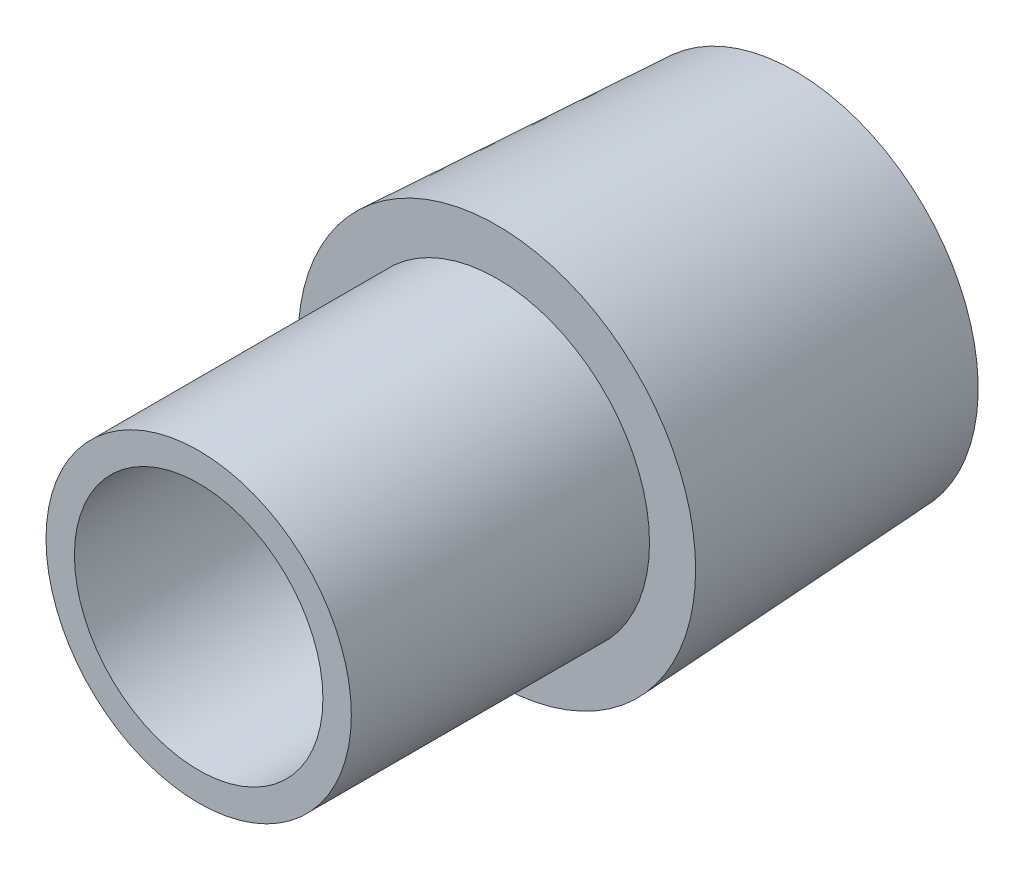
ISO-10303-21;
HEADER;
FILE_DESCRIPTION(('STEP AP214'),'2;1');
FILE_NAME('part.step','',(''),(''),'','','');
FILE_SCHEMA(('AUTOMOTIVE_DESIGN { 1 0 10303 214 1 1 1 1 }'));
ENDSEC;
DATA;
#1=APPLICATION_CONTEXT('core data for automotive mechanical design processes');
#2=APPLICATION_PROTOCOL_DEFINITION('international standard','automotive_design',2000,#1);
#3=PRODUCT_CONTEXT('',#1,'mechanical');
#4=PRODUCT('Part','Part','',(#3));
#5=PRODUCT_RELATED_PRODUCT_CATEGORY('part','',(#4));
#6=PRODUCT_DEFINITION_FORMATION('','',#4);
#7=PRODUCT_DEFINITION_CONTEXT('part definition',#1,'design');
#8=PRODUCT_DEFINITION('design','',#6,#7);
#9=PRODUCT_DEFINITION_SHAPE('','',#8);
#10=(LENGTH_UNIT() NAMED_UNIT(*) SI_UNIT(.MILLI.,.METRE.));
#11=(NAMED_UNIT(*) PLANE_ANGLE_UNIT() SI_UNIT($,.RADIAN.));
#12=(NAMED_UNIT(*) SI_UNIT($,.STERADIAN.) SOLID_ANGLE_UNIT());
#13=UNCERTAINTY_MEASURE_WITH_UNIT(LENGTH_MEASURE(1.E-05),#10,'distance_accuracy_value','');
#14=(GEOMETRIC_REPRESENTATION_CONTEXT(3) GLOBAL_UNCERTAINTY_ASSIGNED_CONTEXT((#13)) GLOBAL_UNIT_ASSIGNED_CONTEXT((#10,
#11,#12)) REPRESENTATION_CONTEXT('',''));
#15=CARTESIAN_POINT('',(0.,0.,0.));
#16=DIRECTION('',(0.,0.,1.));
#17=DIRECTION('',(1.,0.,0.));
#18=AXIS2_PLACEMENT_3D('',#15,#16,#17);
#19=CARTESIAN_POINT('',(0.,0.,9.525));
#20=DIRECTION('',(0.,0.,1.));
#21=DIRECTION('',(1.,0.,0.));
#22=AXIS2_PLACEMENT_3D('',#19,#20,#21);
#23=PLANE('',#22);
#24=CARTESIAN_POINT('',(0.,0.,9.525));
#25=DIRECTION('',(0.,0.,1.));
#26=DIRECTION('',(1.,0.,0.));
#27=AXIS2_PLACEMENT_3D('',#24,#25,#26);
#28=CIRCLE('',#27,4.8768);
#29=CARTESIAN_POINT('',(-4.8768,0.,9.525));
#30=VERTEX_POINT('',#29);
#31=EDGE_CURVE('E10',#30,#30,#28,.T.);
#32=ORIENTED_EDGE('',*,*,#31,.T.);
#33=EDGE_LOOP('',(#32));
#34=FACE_BOUND('',#33,.T.);
#35=CARTESIAN_POINT('',(0.,0.,9.525));
#36=DIRECTION('',(0.,0.,1.));
#37=DIRECTION('',(1.,0.,0.));
#38=AXIS2_PLACEMENT_3D('',#35,#36,#37);
#39=CIRCLE('',#38,3.96875);
#40=CARTESIAN_POINT('',(-3.96875,0.,9.525));
#41=VERTEX_POINT('',#40);
#42=EDGE_CURVE('E42',#41,#41,#39,.T.);
#43=ORIENTED_EDGE('',*,*,#42,.F.);
#44=EDGE_LOOP('',(#43));
#45=FACE_BOUND('',#44,.T.);
#46=ADVANCED_FACE('F34',(#34,#45),#23,.T.);
#47=CARTESIAN_POINT('',(0.,0.,9.525));
#48=DIRECTION('',(0.,0.,-1.));
#49=DIRECTION('',(-1.,0.,0.));
#50=AXIS2_PLACEMENT_3D('',#47,#48,#49);
#51=CYLINDRICAL_SURFACE('',#50,4.8768);
#52=CARTESIAN_POINT('',(0.,0.,0.));
#53=DIRECTION('',(0.,0.,-1.));
#54=DIRECTION('',(-1.,0.,0.));
#55=AXIS2_PLACEMENT_3D('',#52,#53,#54);
#56=CIRCLE('',#55,4.8768);
#57=CARTESIAN_POINT('',(-4.8768,0.,0.));
#58=VERTEX_POINT('',#57);
#59=EDGE_CURVE('E46',#58,#58,#56,.T.);
#60=CARTESIAN_POINT('',(-4.8768,0.,9.525));
#61=CARTESIAN_POINT('',(-4.8768,0.,9.42578125));
#62=CARTESIAN_POINT('',(-4.8768,0.,9.3265625));
#63=CARTESIAN_POINT('',(-4.8768,0.,9.128125));
#64=CARTESIAN_POINT('',(-4.8768,0.,9.02890625));
#65=CARTESIAN_POINT('',(-4.8768,0.,8.83046875));
#66=CARTESIAN_POINT('',(-4.8768,0.,8.73125));
#67=CARTESIAN_POINT('',(-4.8768,0.,8.5328125));
#68=CARTESIAN_POINT('',(-4.8768,0.,8.43359375));
#69=CARTESIAN_POINT('',(-4.8768,0.,8.23515625));
#70=CARTESIAN_POINT('',(-4.8768,0.,8.1359375));
#71=CARTESIAN_POINT('',(-4.8768,0.,7.9375));
#72=CARTESIAN_POINT('',(-4.8768,0.,7.83828125));
#73=CARTESIAN_POINT('',(-4.8768,0.,7.63984375));
#74=CARTESIAN_POINT('',(-4.8768,0.,7.540625));
#75=CARTESIAN_POINT('',(-4.8768,0.,7.3421875));
#76=CARTESIAN_POINT('',(-4.8768,0.,7.24296875));
#77=CARTESIAN_POINT('',(-4.8768,0.,7.04453125));
#78=CARTESIAN_POINT('',(-4.8768,0.,6.9453125));
#79=CARTESIAN_POINT('',(-4.8768,0.,6.746875));
#80=CARTESIAN_POINT('',(-4.8768,0.,6.64765625));
#81=CARTESIAN_POINT('',(-4.8768,0.,6.44921875));
#82=CARTESIAN_POINT('',(-4.8768,0.,6.35));
#83=CARTESIAN_POINT('',(-4.8768,0.,6.1515625));
#84=CARTESIAN_POINT('',(-4.8768,0.,6.05234375));
#85=CARTESIAN_POINT('',(-4.8768,0.,5.85390625));
#86=CARTESIAN_POINT('',(-4.8768,0.,5.7546875));
#87=CARTESIAN_POINT('',(-4.8768,0.,5.55625));
#88=CARTESIAN_POINT('',(-4.8768,0.,5.45703125));
#89=CARTESIAN_POINT('',(-4.8768,0.,5.25859375));
#90=CARTESIAN_POINT('',(-4.8768,0.,5.159375));
#91=CARTESIAN_POINT('',(-4.8768,0.,4.9609375));
#92=CARTESIAN_POINT('',(-4.8768,0.,4.86171875));
#93=CARTESIAN_POINT('',(-4.8768,0.,4.66328125));
#94=CARTESIAN_POINT('',(-4.8768,0.,4.5640625));
#95=CARTESIAN_POINT('',(-4.8768,0.,4.365625));
#96=CARTESIAN_POINT('',(-4.8768,0.,4.26640625));
#97=CARTESIAN_POINT('',(-4.8768,0.,4.06796875));
#98=CARTESIAN_POINT('',(-4.8768,0.,3.96875));
#99=CARTESIAN_POINT('',(-4.8768,0.,3.7703125));
#100=CARTESIAN_POINT('',(-4.8768,0.,3.67109375));
#101=CARTESIAN_POINT('',(-4.8768,0.,3.47265625));
#102=CARTESIAN_POINT('',(-4.8768,0.,3.3734375));
#103=CARTESIAN_POINT('',(-4.8768,0.,3.175));
#104=CARTESIAN_POINT('',(-4.8768,0.,3.07578125));
#105=CARTESIAN_POINT('',(-4.8768,0.,2.87734375));
#106=CARTESIAN_POINT('',(-4.8768,0.,2.778125));
#107=CARTESIAN_POINT('',(-4.8768,0.,2.5796875));
#108=CARTESIAN_POINT('',(-4.8768,0.,2.48046875));
#109=CARTESIAN_POINT('',(-4.8768,0.,2.28203125));
#110=CARTESIAN_POINT('',(-4.8768,0.,2.1828125));
#111=CARTESIAN_POINT('',(-4.8768,0.,1.984375));
#112=CARTESIAN_POINT('',(-4.8768,0.,1.88515625));
#113=CARTESIAN_POINT('',(-4.8768,0.,1.68671875));
#114=CARTESIAN_POINT('',(-4.8768,0.,1.5875));
#115=CARTESIAN_POINT('',(-4.8768,0.,1.3890625));
#116=CARTESIAN_POINT('',(-4.8768,0.,1.28984375));
#117=CARTESIAN_POINT('',(-4.8768,0.,1.09140625));
#118=CARTESIAN_POINT('',(-4.8768,0.,0.992187500000001));
#119=CARTESIAN_POINT('',(-4.8768,0.,0.793750000000001));
#120=CARTESIAN_POINT('',(-4.8768,0.,0.69453125));
#121=CARTESIAN_POINT('',(-4.8768,0.,0.49609375));
#122=CARTESIAN_POINT('',(-4.8768,0.,0.396875));
#123=CARTESIAN_POINT('',(-4.8768,0.,0.1984375));
#124=CARTESIAN_POINT('',(-4.8768,0.,0.0992187500000001));
#125=CARTESIAN_POINT('',(-4.8768,0.,0.));
#126=B_SPLINE_CURVE_WITH_KNOTS('',3,(#60,#61,#62,#63,#64,#65,#66,#67,#68,#69,#70,#71,#72,#73,
#74,#75,#76,#77,#78,#79,#80,#81,#82,#83,#84,#85,#86,#87,#88,#89,#90,#91,#92,#93,#94,#95,#96,#97,
#98,#99,#100,#101,#102,#103,#104,#105,#106,#107,#108,#109,#110,#111,#112,#113,#114,#115,#116,
#117,#118,#119,#120,#121,#122,#123,#124,#125),.UNSPECIFIED.,.F.,.F.,(4,2,2,2,2,2,2,2,2,2,2,2,2,
2,2,2,2,2,2,2,2,2,2,2,2,2,2,2,2,2,2,2,4),(0.,0.29765625,0.5953125,0.892968750000001,1.190625,
1.48828125,1.7859375,2.08359375,2.38125,2.67890625,2.9765625,3.27421875,3.571875,3.86953125,
4.1671875,4.46484375,4.7625,5.06015625,5.3578125,5.65546875,5.953125,6.25078125,6.5484375,
6.84609375,7.14375,7.44140625,7.7390625,8.03671875,8.334375,8.63203125,8.9296875,9.22734375,
9.525),.UNSPECIFIED.);
#127=EDGE_CURVE('BSEAM74',#30,#58,#126,.T.);
#128=ORIENTED_EDGE('',*,*,#31,.F.);
#129=ORIENTED_EDGE('',*,*,#59,.F.);
#130=ORIENTED_EDGE('',*,*,#127,.T.);
#131=ORIENTED_EDGE('',*,*,#127,.F.);
#132=EDGE_LOOP('',(#128,#130,#129,#131));
#133=FACE_BOUND('',#132,.T.);
#134=ADVANCED_FACE('F74',(#133),#51,.T.);
#135=CARTESIAN_POINT('',(0.,0.,9.525));
#136=DIRECTION('',(0.,0.,-1.));
#137=DIRECTION('',(-1.,0.,0.));
#138=AXIS2_PLACEMENT_3D('',#135,#136,#137);
#139=CYLINDRICAL_SURFACE('',#138,3.96875);
#140=CARTESIAN_POINT('',(0.,0.,-9.525));
#141=DIRECTION('',(0.,0.,-1.));
#142=DIRECTION('',(-1.,0.,0.));
#143=AXIS2_PLACEMENT_3D('',#140,#141,#142);
#144=CIRCLE('',#143,3.96875);
#145=CARTESIAN_POINT('',(-3.96875,0.,-9.525));
#146=VERTEX_POINT('',#145);
#147=EDGE_CURVE('E54',#146,#146,#144,.T.);
#148=CARTESIAN_POINT('',(-3.96875,0.,9.525));
#149=CARTESIAN_POINT('',(-3.96875,0.,9.3265625));
#150=CARTESIAN_POINT('',(-3.96875,0.,9.128125));
#151=CARTESIAN_POINT('',(-3.96875,0.,8.73125));
#152=CARTESIAN_POINT('',(-3.96875,0.,8.5328125));
#153=CARTESIAN_POINT('',(-3.96875,0.,8.1359375));
#154=CARTESIAN_POINT('',(-3.96875,0.,7.9375));
#155=CARTESIAN_POINT('',(-3.96875,0.,7.540625));
#156=CARTESIAN_POINT('',(-3.96875,0.,7.3421875));
#157=CARTESIAN_POINT('',(-3.96875,0.,6.9453125));
#158=CARTESIAN_POINT('',(-3.96875,0.,6.746875));
#159=CARTESIAN_POINT('',(-3.96875,0.,6.35));
#160=CARTESIAN_POINT('',(-3.96875,0.,6.1515625));
#161=CARTESIAN_POINT('',(-3.96875,0.,5.7546875));
#162=CARTESIAN_POINT('',(-3.96875,0.,5.55625));
#163=CARTESIAN_POINT('',(-3.96875,0.,5.159375));
#164=CARTESIAN_POINT('',(-3.96875,0.,4.9609375));
#165=CARTESIAN_POINT('',(-3.96875,0.,4.5640625));
#166=CARTESIAN_POINT('',(-3.96875,0.,4.365625));
#167=CARTESIAN_POINT('',(-3.96875,0.,3.96875));
#168=CARTESIAN_POINT('',(-3.96875,0.,3.7703125));
#169=CARTESIAN_POINT('',(-3.96875,0.,3.3734375));
#170=CARTESIAN_POINT('',(-3.96875,0.,3.175));
#171=CARTESIAN_POINT('',(-3.96875,0.,2.778125));
#172=CARTESIAN_POINT('',(-3.96875,0.,2.5796875));
#173=CARTESIAN_POINT('',(-3.96875,0.,2.1828125));
#174=CARTESIAN_POINT('',(-3.96875,0.,1.984375));
#175=CARTESIAN_POINT('',(-3.96875,0.,1.5875));
#176=CARTESIAN_POINT('',(-3.96875,0.,1.3890625));
#177=CARTESIAN_POINT('',(-3.96875,0.,0.992187500000001));
#178=CARTESIAN_POINT('',(-3.96875,0.,0.793750000000001));
#179=CARTESIAN_POINT('',(-3.96875,0.,0.396875));
#180=CARTESIAN_POINT('',(-3.96875,0.,0.1984375));
#181=CARTESIAN_POINT('',(-3.96875,0.,-0.1984375));
#182=CARTESIAN_POINT('',(-3.96875,0.,-0.396875));
#183=CARTESIAN_POINT('',(-3.96875,0.,-0.793750000000001));
#184=CARTESIAN_POINT('',(-3.96875,0.,-0.992187500000001));
#185=CARTESIAN_POINT('',(-3.96875,0.,-1.3890625));
#186=CARTESIAN_POINT('',(-3.96875,0.,-1.5875));
#187=CARTESIAN_POINT('',(-3.96875,0.,-1.984375));
#188=CARTESIAN_POINT('',(-3.96875,0.,-2.1828125));
#189=CARTESIAN_POINT('',(-3.96875,0.,-2.5796875));
#190=CARTESIAN_POINT('',(-3.96875,0.,-2.778125));
#191=CARTESIAN_POINT('',(-3.96875,0.,-3.175));
#192=CARTESIAN_POINT('',(-3.96875,0.,-3.3734375));
#193=CARTESIAN_POINT('',(-3.96875,0.,-3.7703125));
#194=CARTESIAN_POINT('',(-3.96875,0.,-3.96875));
#195=CARTESIAN_POINT('',(-3.96875,0.,-4.365625));
#196=CARTESIAN_POINT('',(-3.96875,0.,-4.5640625));
#197=CARTESIAN_POINT('',(-3.96875,0.,-4.9609375));
#198=CARTESIAN_POINT('',(-3.96875,0.,-5.159375));
#199=CARTESIAN_POINT('',(-3.96875,0.,-5.55625));
#200=CARTESIAN_POINT('',(-3.96875,0.,-5.7546875));
#201=CARTESIAN_POINT('',(-3.96875,0.,-6.1515625));
#202=CARTESIAN_POINT('',(-3.96875,0.,-6.35));
#203=CARTESIAN_POINT('',(-3.96875,0.,-6.746875));
#204=CARTESIAN_POINT('',(-3.96875,0.,-6.9453125));
#205=CARTESIAN_POINT('',(-3.96875,0.,-7.3421875));
#206=CARTESIAN_POINT('',(-3.96875,0.,-7.540625));
#207=CARTESIAN_POINT('',(-3.96875,0.,-7.9375));
#208=CARTESIAN_POINT('',(-3.96875,0.,-8.1359375));
#209=CARTESIAN_POINT('',(-3.96875,0.,-8.5328125));
#210=CARTESIAN_POINT('',(-3.96875,0.,-8.73125));
#211=CARTESIAN_POINT('',(-3.96875,0.,-9.128125));
#212=CARTESIAN_POINT('',(-3.96875,0.,-9.3265625));
#213=CARTESIAN_POINT('',(-3.96875,0.,-9.525));
#214=B_SPLINE_CURVE_WITH_KNOTS('',3,(#148,#149,#150,#151,#152,#153,#154,#155,#156,#157,#158,
#159,#160,#161,#162,#163,#164,#165,#166,#167,#168,#169,#170,#171,#172,#173,#174,#175,#176,#177,
#178,#179,#180,#181,#182,#183,#184,#185,#186,#187,#188,#189,#190,#191,#192,#193,#194,#195,#196,
#197,#198,#199,#200,#201,#202,#203,#204,#205,#206,#207,#208,#209,#210,#211,#212,#213),
.UNSPECIFIED.,.F.,.F.,(4,2,2,2,2,2,2,2,2,2,2,2,2,2,2,2,2,2,2,2,2,2,2,2,2,2,2,2,2,2,2,2,4),(0.,
0.5953125,1.190625,1.7859375,2.38125,2.9765625,3.571875,4.1671875,4.7625,5.3578125,5.953125,
6.5484375,7.14375,7.7390625,8.334375,8.9296875,9.525,10.1203125,10.715625,11.3109375,11.90625,
12.5015625,13.096875,13.6921875,14.2875,14.8828125,15.478125,16.0734375,16.66875,17.2640625,
17.859375,18.4546875,19.05),.UNSPECIFIED.);
#215=EDGE_CURVE('BSEAM58',#41,#146,#214,.T.);
#216=ORIENTED_EDGE('',*,*,#42,.T.);
#217=ORIENTED_EDGE('',*,*,#147,.T.);
#218=ORIENTED_EDGE('',*,*,#215,.T.);
#219=ORIENTED_EDGE('',*,*,#215,.F.);
#220=EDGE_LOOP('',(#216,#218,#217,#219));
#221=FACE_BOUND('',#220,.T.);
#222=ADVANCED_FACE('F58',(#221),#139,.F.);
#223=CARTESIAN_POINT('',(0.,0.,0.));
#224=DIRECTION('',(0.,0.,-1.));
#225=DIRECTION('',(-1.,0.,0.));
#226=AXIS2_PLACEMENT_3D('',#223,#224,#225);
#227=PLANE('',#226);
#228=CARTESIAN_POINT('',(0.,0.,0.));
#229=DIRECTION('',(0.,0.,-1.));
#230=DIRECTION('',(-1.,0.,0.));
#231=AXIS2_PLACEMENT_3D('',#228,#229,#230);
#232=CIRCLE('',#231,6.35);
#233=CARTESIAN_POINT('',(-6.35,0.,0.));
#234=VERTEX_POINT('',#233);
#235=EDGE_CURVE('E51',#234,#234,#232,.T.);
#236=ORIENTED_EDGE('',*,*,#235,.F.);
#237=EDGE_LOOP('',(#236));
#238=FACE_BOUND('',#237,.T.);
#239=ORIENTED_EDGE('',*,*,#59,.T.);
#240=EDGE_LOOP('',(#239));
#241=FACE_BOUND('',#240,.T.);
#242=ADVANCED_FACE('F62',(#238,#241),#227,.F.);
#243=CARTESIAN_POINT('',(0.,0.,-9.525));
#244=DIRECTION('',(0.,0.,-1.));
#245=DIRECTION('',(-1.,0.,0.));
#246=AXIS2_PLACEMENT_3D('',#243,#244,#245);
#247=PLANE('',#246);
#248=CARTESIAN_POINT('',(0.,0.,-9.525));
#249=DIRECTION('',(0.,0.,-1.));
#250=DIRECTION('',(-1.,0.,0.));
#251=AXIS2_PLACEMENT_3D('',#248,#249,#250);
#252=CIRCLE('',#251,5.85081590232903);
#253=CARTESIAN_POINT('',(-5.85081590232903,0.,-9.525));
#254=VERTEX_POINT('',#253);
#255=EDGE_CURVE('E38',#254,#254,#252,.T.);
#256=ORIENTED_EDGE('',*,*,#255,.T.);
#257=EDGE_LOOP('',(#256));
#258=FACE_BOUND('',#257,.T.);
#259=ORIENTED_EDGE('',*,*,#147,.F.);
#260=EDGE_LOOP('',(#259));
#261=FACE_BOUND('',#260,.T.);
#262=ADVANCED_FACE('F60',(#258,#261),#247,.T.);
#263=CARTESIAN_POINT('',(0.,0.,0.));
#264=DIRECTION('',(0.,0.,1.));
#265=DIRECTION('',(-1.,0.,0.));
#266=AXIS2_PLACEMENT_3D('',#263,#264,#265);
#267=CONICAL_SURFACE('',#266,6.35,0.05235987755983);
#268=ORIENTED_EDGE('',*,*,#255,.F.);
#269=EDGE_LOOP('',(#268));
#270=FACE_BOUND('',#269,.T.);
#271=ORIENTED_EDGE('',*,*,#235,.T.);
#272=EDGE_LOOP('',(#271));
#273=FACE_BOUND('',#272,.T.);
#274=ADVANCED_FACE('F36',(#270,#273),#267,.T.);
#275=CLOSED_SHELL('',(#46,#134,#222,#242,#262,#274));
#276=MANIFOLD_SOLID_BREP('B2',#275);
#277=ADVANCED_BREP_SHAPE_REPRESENTATION('',(#18,#276),#14);
#278=SHAPE_DEFINITION_REPRESENTATION(#9,#277);
ENDSEC;
END-ISO-10303-21;
